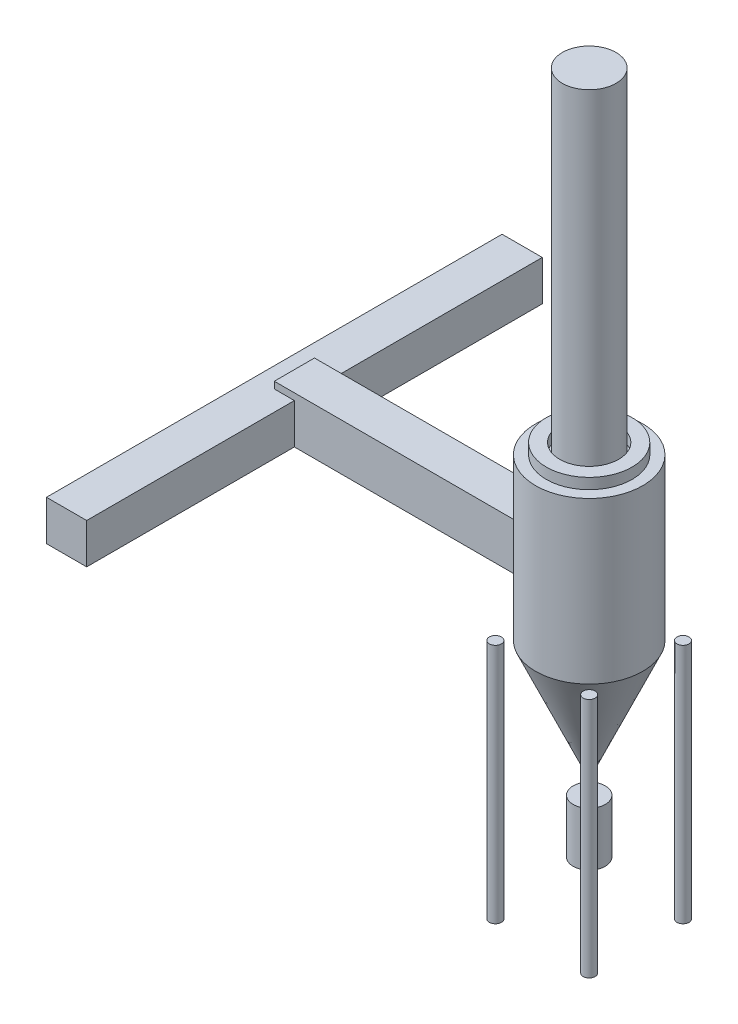
ISO-10303-21;
HEADER;
FILE_DESCRIPTION(('STEP AP214'),'2;1');
FILE_NAME('part.step','',(''),(''),'','','');
FILE_SCHEMA(('AUTOMOTIVE_DESIGN { 1 0 10303 214 1 1 1 1 }'));
ENDSEC;
DATA;
#1=APPLICATION_CONTEXT('core data for automotive mechanical design processes');
#2=APPLICATION_PROTOCOL_DEFINITION('international standard','automotive_design',2000,#1);
#3=PRODUCT_CONTEXT('',#1,'mechanical');
#4=PRODUCT('Part','Part','',(#3));
#5=PRODUCT_RELATED_PRODUCT_CATEGORY('part','',(#4));
#6=PRODUCT_DEFINITION_FORMATION('','',#4);
#7=PRODUCT_DEFINITION_CONTEXT('part definition',#1,'design');
#8=PRODUCT_DEFINITION('design','',#6,#7);
#9=PRODUCT_DEFINITION_SHAPE('','',#8);
#10=(LENGTH_UNIT() NAMED_UNIT(*) SI_UNIT(.MILLI.,.METRE.));
#11=(NAMED_UNIT(*) PLANE_ANGLE_UNIT() SI_UNIT($,.RADIAN.));
#12=(NAMED_UNIT(*) SI_UNIT($,.STERADIAN.) SOLID_ANGLE_UNIT());
#13=UNCERTAINTY_MEASURE_WITH_UNIT(LENGTH_MEASURE(1.E-05),#10,'distance_accuracy_value','');
#14=(GEOMETRIC_REPRESENTATION_CONTEXT(3) GLOBAL_UNCERTAINTY_ASSIGNED_CONTEXT((#13)) GLOBAL_UNIT_ASSIGNED_CONTEXT((#10,
#11,#12)) REPRESENTATION_CONTEXT('',''));
#15=CARTESIAN_POINT('',(0.,0.,0.));
#16=DIRECTION('',(0.,0.,1.));
#17=DIRECTION('',(1.,0.,0.));
#18=AXIS2_PLACEMENT_3D('',#15,#16,#17);
#19=CARTESIAN_POINT('',(150.,2400.,-3800.));
#20=DIRECTION('',(-1.,0.,0.));
#21=DIRECTION('',(0.,0.,1.));
#22=AXIS2_PLACEMENT_3D('',#19,#20,#21);
#23=PLANE('',#22);
#24=DIRECTION('',(0.,-1.,0.));
#25=VECTOR('',#24,1.);
#26=CARTESIAN_POINT('',(150.,2400.,-5350.));
#27=LINE('',#26,#25);
#28=CARTESIAN_POINT('',(150.,2400.,-5350.));
#29=VERTEX_POINT('',#28);
#30=CARTESIAN_POINT('',(150.,2100.,-5350.));
#31=VERTEX_POINT('',#30);
#32=EDGE_CURVE('E160',#29,#31,#27,.T.);
#33=ORIENTED_EDGE('',*,*,#32,.F.);
#34=DIRECTION('',(0.,0.,-1.));
#35=VECTOR('',#34,1.);
#36=CARTESIAN_POINT('',(150.,2400.,-3800.));
#37=LINE('',#36,#35);
#38=CARTESIAN_POINT('',(150.,2400.,-3800.));
#39=VERTEX_POINT('',#38);
#40=EDGE_CURVE('E172',#39,#29,#37,.T.);
#41=ORIENTED_EDGE('',*,*,#40,.F.);
#42=DIRECTION('',(0.,-1.,0.));
#43=VECTOR('',#42,1.);
#44=CARTESIAN_POINT('',(150.,2400.,-3800.));
#45=LINE('',#44,#43);
#46=CARTESIAN_POINT('',(150.,2100.,-3800.));
#47=VERTEX_POINT('',#46);
#48=EDGE_CURVE('E58',#39,#47,#45,.T.);
#49=ORIENTED_EDGE('',*,*,#48,.T.);
#50=DIRECTION('',(0.,0.,-1.));
#51=VECTOR('',#50,1.);
#52=CARTESIAN_POINT('',(150.,2100.,-3800.));
#53=LINE('',#52,#51);
#54=EDGE_CURVE('E182',#47,#31,#53,.T.);
#55=ORIENTED_EDGE('',*,*,#54,.T.);
#56=EDGE_LOOP('',(#33,#41,#49,#55));
#57=FACE_BOUND('',#56,.T.);
#58=ADVANCED_FACE('F50',(#57),#23,.F.);
#59=DIRECTION('',(0.,1.,0.));
#60=VECTOR('',#59,1.);
#61=CARTESIAN_POINT('',(150.,2400.,-5650.));
#62=LINE('',#61,#60);
#63=CARTESIAN_POINT('',(150.,2100.,-5650.));
#64=VERTEX_POINT('',#63);
#65=CARTESIAN_POINT('',(150.,2400.,-5650.));
#66=VERTEX_POINT('',#65);
#67=EDGE_CURVE('E151',#64,#66,#62,.T.);
#68=ORIENTED_EDGE('',*,*,#67,.F.);
#69=CARTESIAN_POINT('',(150.,2100.,-7200.));
#70=VERTEX_POINT('',#69);
#71=EDGE_CURVE('E181',#64,#70,#53,.T.);
#72=ORIENTED_EDGE('',*,*,#71,.T.);
#73=DIRECTION('',(0.,-1.,0.));
#74=VECTOR('',#73,1.);
#75=CARTESIAN_POINT('',(150.,2400.,-7200.));
#76=LINE('',#75,#74);
#77=CARTESIAN_POINT('',(150.,2400.,-7200.));
#78=VERTEX_POINT('',#77);
#79=EDGE_CURVE('E187',#78,#70,#76,.T.);
#80=ORIENTED_EDGE('',*,*,#79,.F.);
#81=EDGE_CURVE('E171',#66,#78,#37,.T.);
#82=ORIENTED_EDGE('',*,*,#81,.F.);
#83=EDGE_LOOP('',(#68,#72,#80,#82));
#84=FACE_BOUND('',#83,.T.);
#85=ADVANCED_FACE('F220',(#84),#23,.F.);
#86=CARTESIAN_POINT('',(0.,2400.,0.));
#87=DIRECTION('',(0.,-1.,0.));
#88=DIRECTION('',(0.,0.,-1.));
#89=AXIS2_PLACEMENT_3D('',#86,#87,#88);
#90=PLANE('',#89);
#91=DIRECTION('',(1.,0.,0.));
#92=VECTOR('',#91,1.);
#93=CARTESIAN_POINT('',(0.,2400.,-5350.));
#94=LINE('',#93,#92);
#95=CARTESIAN_POINT('',(0.,2400.,-5350.));
#96=VERTEX_POINT('',#95);
#97=EDGE_CURVE('E65',#96,#29,#94,.T.);
#98=ORIENTED_EDGE('',*,*,#97,.F.);
#99=DIRECTION('',(0.,0.,1.));
#100=VECTOR('',#99,1.);
#101=CARTESIAN_POINT('',(0.,2400.,0.));
#102=LINE('',#101,#100);
#103=CARTESIAN_POINT('',(0.,2400.,-5650.));
#104=VERTEX_POINT('',#103);
#105=EDGE_CURVE('E149',#104,#96,#102,.T.);
#106=ORIENTED_EDGE('',*,*,#105,.F.);
#107=DIRECTION('',(-1.,0.,0.));
#108=VECTOR('',#107,1.);
#109=CARTESIAN_POINT('',(0.,2400.,-5650.));
#110=LINE('',#109,#108);
#111=EDGE_CURVE('E71',#66,#104,#110,.T.);
#112=ORIENTED_EDGE('',*,*,#111,.F.);
#113=ORIENTED_EDGE('',*,*,#81,.T.);
#114=DIRECTION('',(-1.,0.,0.));
#115=VECTOR('',#114,1.);
#116=CARTESIAN_POINT('',(-150.,2400.,-7200.));
#117=LINE('',#116,#115);
#118=CARTESIAN_POINT('',(-150.,2400.,-7200.));
#119=VERTEX_POINT('',#118);
#120=EDGE_CURVE('E174',#78,#119,#117,.T.);
#121=ORIENTED_EDGE('',*,*,#120,.T.);
#122=DIRECTION('',(0.,0.,1.));
#123=VECTOR('',#122,1.);
#124=CARTESIAN_POINT('',(-150.,2400.,-3800.));
#125=LINE('',#124,#123);
#126=CARTESIAN_POINT('',(-150.,2400.,-3800.));
#127=VERTEX_POINT('',#126);
#128=EDGE_CURVE('E165',#119,#127,#125,.T.);
#129=ORIENTED_EDGE('',*,*,#128,.T.);
#130=DIRECTION('',(1.,0.,0.));
#131=VECTOR('',#130,1.);
#132=CARTESIAN_POINT('',(-150.,2400.,-3800.));
#133=LINE('',#132,#131);
#134=EDGE_CURVE('E168',#127,#39,#133,.T.);
#135=ORIENTED_EDGE('',*,*,#134,.T.);
#136=ORIENTED_EDGE('',*,*,#40,.T.);
#137=EDGE_LOOP('',(#98,#106,#112,#113,#121,#129,#135,#136));
#138=FACE_BOUND('',#137,.T.);
#139=ADVANCED_FACE('F226',(#138),#90,.F.);
#140=CARTESIAN_POINT('',(-150.,2400.,-3800.));
#141=DIRECTION('',(1.,0.,0.));
#142=DIRECTION('',(0.,0.,-1.));
#143=AXIS2_PLACEMENT_3D('',#140,#141,#142);
#144=PLANE('',#143);
#145=DIRECTION('',(0.,0.,1.));
#146=VECTOR('',#145,1.);
#147=CARTESIAN_POINT('',(-150.,2100.,-3800.));
#148=LINE('',#147,#146);
#149=CARTESIAN_POINT('',(-150.,2100.,-7200.));
#150=VERTEX_POINT('',#149);
#151=CARTESIAN_POINT('',(-150.,2100.,-3800.));
#152=VERTEX_POINT('',#151);
#153=EDGE_CURVE('E164',#150,#152,#148,.T.);
#154=ORIENTED_EDGE('',*,*,#153,.T.);
#155=DIRECTION('',(0.,-1.,0.));
#156=VECTOR('',#155,1.);
#157=CARTESIAN_POINT('',(-150.,2400.,-3800.));
#158=LINE('',#157,#156);
#159=EDGE_CURVE('E12',#127,#152,#158,.T.);
#160=ORIENTED_EDGE('',*,*,#159,.F.);
#161=ORIENTED_EDGE('',*,*,#128,.F.);
#162=DIRECTION('',(0.,-1.,0.));
#163=VECTOR('',#162,1.);
#164=CARTESIAN_POINT('',(-150.,2400.,-7200.));
#165=LINE('',#164,#163);
#166=EDGE_CURVE('E176',#119,#150,#165,.T.);
#167=ORIENTED_EDGE('',*,*,#166,.T.);
#168=EDGE_LOOP('',(#154,#160,#161,#167));
#169=FACE_BOUND('',#168,.T.);
#170=ADVANCED_FACE('F52',(#169),#144,.F.);
#171=CARTESIAN_POINT('',(-150.,2400.,-3800.));
#172=DIRECTION('',(0.,0.,-1.));
#173=DIRECTION('',(-1.,0.,0.));
#174=AXIS2_PLACEMENT_3D('',#171,#172,#173);
#175=PLANE('',#174);
#176=DIRECTION('',(1.,0.,0.));
#177=VECTOR('',#176,1.);
#178=CARTESIAN_POINT('',(-150.,2100.,-3800.));
#179=LINE('',#178,#177);
#180=EDGE_CURVE('E179',#152,#47,#179,.T.);
#181=ORIENTED_EDGE('',*,*,#180,.T.);
#182=ORIENTED_EDGE('',*,*,#48,.F.);
#183=ORIENTED_EDGE('',*,*,#134,.F.);
#184=ORIENTED_EDGE('',*,*,#159,.T.);
#185=EDGE_LOOP('',(#181,#182,#183,#184));
#186=FACE_BOUND('',#185,.T.);
#187=ADVANCED_FACE('F229',(#186),#175,.F.);
#188=CARTESIAN_POINT('',(-150.,2400.,-7200.));
#189=DIRECTION('',(0.,0.,1.));
#190=DIRECTION('',(1.,0.,0.));
#191=AXIS2_PLACEMENT_3D('',#188,#189,#190);
#192=PLANE('',#191);
#193=DIRECTION('',(-1.,0.,0.));
#194=VECTOR('',#193,1.);
#195=CARTESIAN_POINT('',(-150.,2100.,-7200.));
#196=LINE('',#195,#194);
#197=EDGE_CURVE('E169',#70,#150,#196,.T.);
#198=ORIENTED_EDGE('',*,*,#197,.T.);
#199=ORIENTED_EDGE('',*,*,#166,.F.);
#200=ORIENTED_EDGE('',*,*,#120,.F.);
#201=ORIENTED_EDGE('',*,*,#79,.T.);
#202=EDGE_LOOP('',(#198,#199,#200,#201));
#203=FACE_BOUND('',#202,.T.);
#204=ADVANCED_FACE('F223',(#203),#192,.F.);
#205=CARTESIAN_POINT('',(0.,2100.,0.));
#206=DIRECTION('',(0.,-1.,0.));
#207=DIRECTION('',(0.,0.,-1.));
#208=AXIS2_PLACEMENT_3D('',#205,#206,#207);
#209=PLANE('',#208);
#210=ORIENTED_EDGE('',*,*,#71,.F.);
#211=DIRECTION('',(-1.,0.,0.));
#212=VECTOR('',#211,1.);
#213=CARTESIAN_POINT('',(0.,2100.,-5650.));
#214=LINE('',#213,#212);
#215=CARTESIAN_POINT('',(1800.,2100.,-5650.));
#216=VERTEX_POINT('',#215);
#217=EDGE_CURVE('E146',#216,#64,#214,.T.);
#218=ORIENTED_EDGE('',*,*,#217,.F.);
#219=DIRECTION('',(0.,0.,-1.));
#220=VECTOR('',#219,1.);
#221=CARTESIAN_POINT('',(1800.,2100.,-5350.));
#222=LINE('',#221,#220);
#223=CARTESIAN_POINT('',(1800.,2100.,-5350.));
#224=VERTEX_POINT('',#223);
#225=EDGE_CURVE('E203',#224,#216,#222,.T.);
#226=ORIENTED_EDGE('',*,*,#225,.F.);
#227=DIRECTION('',(1.,0.,0.));
#228=VECTOR('',#227,1.);
#229=CARTESIAN_POINT('',(0.,2100.,-5350.));
#230=LINE('',#229,#228);
#231=EDGE_CURVE('E201',#31,#224,#230,.T.);
#232=ORIENTED_EDGE('',*,*,#231,.F.);
#233=ORIENTED_EDGE('',*,*,#54,.F.);
#234=ORIENTED_EDGE('',*,*,#180,.F.);
#235=ORIENTED_EDGE('',*,*,#153,.F.);
#236=ORIENTED_EDGE('',*,*,#197,.F.);
#237=EDGE_LOOP('',(#210,#218,#226,#232,#233,#234,#235,#236));
#238=FACE_BOUND('',#237,.T.);
#239=ADVANCED_FACE('F198',(#238),#209,.T.);
#240=CARTESIAN_POINT('',(0.,2450.,-5350.));
#241=DIRECTION('',(1.,0.,0.));
#242=DIRECTION('',(0.,0.,-1.));
#243=AXIS2_PLACEMENT_3D('',#240,#241,#242);
#244=PLANE('',#243);
#245=DIRECTION('',(0.,-1.,0.));
#246=VECTOR('',#245,1.);
#247=CARTESIAN_POINT('',(0.,2450.,-5650.));
#248=LINE('',#247,#246);
#249=CARTESIAN_POINT('',(0.,2450.,-5650.));
#250=VERTEX_POINT('',#249);
#251=EDGE_CURVE('E211',#250,#104,#248,.T.);
#252=ORIENTED_EDGE('',*,*,#251,.T.);
#253=ORIENTED_EDGE('',*,*,#105,.T.);
#254=DIRECTION('',(0.,-1.,0.));
#255=VECTOR('',#254,1.);
#256=CARTESIAN_POINT('',(0.,2450.,-5350.));
#257=LINE('',#256,#255);
#258=CARTESIAN_POINT('',(0.,2450.,-5350.));
#259=VERTEX_POINT('',#258);
#260=EDGE_CURVE('E131',#259,#96,#257,.T.);
#261=ORIENTED_EDGE('',*,*,#260,.F.);
#262=DIRECTION('',(0.,0.,1.));
#263=VECTOR('',#262,1.);
#264=CARTESIAN_POINT('',(0.,2450.,-5350.));
#265=LINE('',#264,#263);
#266=EDGE_CURVE('E137',#250,#259,#265,.T.);
#267=ORIENTED_EDGE('',*,*,#266,.F.);
#268=EDGE_LOOP('',(#252,#253,#261,#267));
#269=FACE_BOUND('',#268,.T.);
#270=ADVANCED_FACE('F148',(#269),#244,.F.);
#271=CARTESIAN_POINT('',(0.,2450.,-5350.));
#272=DIRECTION('',(0.,0.,-1.));
#273=DIRECTION('',(-1.,0.,0.));
#274=AXIS2_PLACEMENT_3D('',#271,#272,#273);
#275=PLANE('',#274);
#276=ORIENTED_EDGE('',*,*,#97,.T.);
#277=ORIENTED_EDGE('',*,*,#32,.T.);
#278=ORIENTED_EDGE('',*,*,#231,.T.);
#279=DIRECTION('',(0.,-1.,0.));
#280=VECTOR('',#279,1.);
#281=CARTESIAN_POINT('',(1800.,2450.,-5350.));
#282=LINE('',#281,#280);
#283=CARTESIAN_POINT('',(1800.,2450.,-5350.));
#284=VERTEX_POINT('',#283);
#285=EDGE_CURVE('E133',#284,#224,#282,.T.);
#286=ORIENTED_EDGE('',*,*,#285,.F.);
#287=DIRECTION('',(1.,0.,0.));
#288=VECTOR('',#287,1.);
#289=CARTESIAN_POINT('',(0.,2450.,-5350.));
#290=LINE('',#289,#288);
#291=EDGE_CURVE('E127',#259,#284,#290,.T.);
#292=ORIENTED_EDGE('',*,*,#291,.F.);
#293=ORIENTED_EDGE('',*,*,#260,.T.);
#294=EDGE_LOOP('',(#276,#277,#278,#286,#292,#293));
#295=FACE_BOUND('',#294,.T.);
#296=ADVANCED_FACE('F129',(#295),#275,.F.);
#297=CARTESIAN_POINT('',(0.,2450.,-5650.));
#298=DIRECTION('',(0.,0.,1.));
#299=DIRECTION('',(1.,0.,0.));
#300=AXIS2_PLACEMENT_3D('',#297,#298,#299);
#301=PLANE('',#300);
#302=ORIENTED_EDGE('',*,*,#217,.T.);
#303=ORIENTED_EDGE('',*,*,#67,.T.);
#304=ORIENTED_EDGE('',*,*,#111,.T.);
#305=ORIENTED_EDGE('',*,*,#251,.F.);
#306=DIRECTION('',(-1.,0.,0.));
#307=VECTOR('',#306,1.);
#308=CARTESIAN_POINT('',(0.,2450.,-5650.));
#309=LINE('',#308,#307);
#310=CARTESIAN_POINT('',(1800.,2450.,-5650.));
#311=VERTEX_POINT('',#310);
#312=EDGE_CURVE('E142',#311,#250,#309,.T.);
#313=ORIENTED_EDGE('',*,*,#312,.F.);
#314=DIRECTION('',(0.,-1.,0.));
#315=VECTOR('',#314,1.);
#316=CARTESIAN_POINT('',(1800.,2450.,-5650.));
#317=LINE('',#316,#315);
#318=EDGE_CURVE('E153',#311,#216,#317,.T.);
#319=ORIENTED_EDGE('',*,*,#318,.T.);
#320=EDGE_LOOP('',(#302,#303,#304,#305,#313,#319));
#321=FACE_BOUND('',#320,.T.);
#322=ADVANCED_FACE('F215',(#321),#301,.F.);
#323=CARTESIAN_POINT('',(1800.,2450.,-5350.));
#324=DIRECTION('',(-1.,0.,0.));
#325=DIRECTION('',(0.,0.,1.));
#326=AXIS2_PLACEMENT_3D('',#323,#324,#325);
#327=PLANE('',#326);
#328=ORIENTED_EDGE('',*,*,#225,.T.);
#329=ORIENTED_EDGE('',*,*,#318,.F.);
#330=DIRECTION('',(0.,0.,-1.));
#331=VECTOR('',#330,1.);
#332=CARTESIAN_POINT('',(1800.,2450.,-5350.));
#333=LINE('',#332,#331);
#334=EDGE_CURVE('E136',#284,#311,#333,.T.);
#335=ORIENTED_EDGE('',*,*,#334,.F.);
#336=ORIENTED_EDGE('',*,*,#285,.T.);
#337=EDGE_LOOP('',(#328,#329,#335,#336));
#338=FACE_BOUND('',#337,.T.);
#339=ADVANCED_FACE('F250',(#338),#327,.F.);
#340=CARTESIAN_POINT('',(0.,2450.,0.));
#341=DIRECTION('',(0.,-1.,0.));
#342=DIRECTION('',(0.,0.,-1.));
#343=AXIS2_PLACEMENT_3D('',#340,#341,#342);
#344=PLANE('',#343);
#345=ORIENTED_EDGE('',*,*,#266,.T.);
#346=ORIENTED_EDGE('',*,*,#291,.T.);
#347=ORIENTED_EDGE('',*,*,#334,.T.);
#348=ORIENTED_EDGE('',*,*,#312,.T.);
#349=EDGE_LOOP('',(#345,#346,#347,#348));
#350=FACE_BOUND('',#349,.T.);
#351=ADVANCED_FACE('F140',(#350),#344,.F.);
#352=CLOSED_SHELL('',(#58,#85,#139,#170,#187,#204,#239,#270,#296,#322,#339,#351));
#353=MANIFOLD_SOLID_BREP('B2',#352);
#354=CARTESIAN_POINT('',(2200.,1800.,-5500.));
#355=DIRECTION('',(0.,1.,0.));
#356=DIRECTION('',(0.,0.,1.));
#357=AXIS2_PLACEMENT_3D('',#354,#355,#356);
#358=CONICAL_SURFACE('',#357,400.,0.418879020478639);
#359=CARTESIAN_POINT('',(2200.,901.585290438313,-5500.));
#360=VERTEX_POINT('',#359);
#361=VERTEX_LOOP('',#360);
#362=FACE_BOUND('',#361,.T.);
#363=CARTESIAN_POINT('',(2200.,1800.,-5500.));
#364=DIRECTION('',(0.,1.,0.));
#365=DIRECTION('',(0.,0.,1.));
#366=AXIS2_PLACEMENT_3D('',#363,#364,#365);
#367=CIRCLE('',#366,400.);
#368=CARTESIAN_POINT('',(2200.,1800.,-5100.));
#369=VERTEX_POINT('',#368);
#370=EDGE_CURVE('E352',#369,#369,#367,.T.);
#371=ORIENTED_EDGE('',*,*,#370,.F.);
#372=EDGE_LOOP('',(#371));
#373=FACE_BOUND('',#372,.T.);
#374=ADVANCED_FACE('F338',(#362,#373),#358,.T.);
#375=CARTESIAN_POINT('',(2200.,3000.,-5500.));
#376=DIRECTION('',(0.,-1.,0.));
#377=DIRECTION('',(0.,0.,-1.));
#378=AXIS2_PLACEMENT_3D('',#375,#376,#377);
#379=CYLINDRICAL_SURFACE('',#378,400.);
#380=CARTESIAN_POINT('',(2200.,3000.,-5500.));
#381=DIRECTION('',(0.,1.,0.));
#382=DIRECTION('',(0.,0.,1.));
#383=AXIS2_PLACEMENT_3D('',#380,#381,#382);
#384=CIRCLE('',#383,400.);
#385=CARTESIAN_POINT('',(2200.,3000.,-5100.));
#386=VERTEX_POINT('',#385);
#387=EDGE_CURVE('E354',#386,#386,#384,.T.);
#388=ORIENTED_EDGE('',*,*,#387,.F.);
#389=EDGE_LOOP('',(#388));
#390=FACE_BOUND('',#389,.T.);
#391=ORIENTED_EDGE('',*,*,#370,.T.);
#392=EDGE_LOOP('',(#391));
#393=FACE_BOUND('',#392,.T.);
#394=ADVANCED_FACE('F349',(#390,#393),#379,.T.);
#395=CARTESIAN_POINT('',(2200.,3000.,-5500.));
#396=DIRECTION('',(0.,1.,0.));
#397=DIRECTION('',(0.,0.,1.));
#398=AXIS2_PLACEMENT_3D('',#395,#396,#397);
#399=PLANE('',#398);
#400=CARTESIAN_POINT('',(2200.,3000.,-5500.));
#401=DIRECTION('',(0.,1.,0.));
#402=DIRECTION('',(0.,0.,1.));
#403=AXIS2_PLACEMENT_3D('',#400,#401,#402);
#404=CIRCLE('',#403,320.);
#405=CARTESIAN_POINT('',(2200.,3000.,-5180.));
#406=VERTEX_POINT('',#405);
#407=EDGE_CURVE('E364',#406,#406,#404,.T.);
#408=ORIENTED_EDGE('',*,*,#407,.F.);
#409=EDGE_LOOP('',(#408));
#410=FACE_BOUND('',#409,.T.);
#411=ORIENTED_EDGE('',*,*,#387,.T.);
#412=EDGE_LOOP('',(#411));
#413=FACE_BOUND('',#412,.T.);
#414=ADVANCED_FACE('F379',(#410,#413),#399,.T.);
#415=CARTESIAN_POINT('',(2200.,3080.,-5500.));
#416=DIRECTION('',(0.,1.,0.));
#417=DIRECTION('',(0.,0.,1.));
#418=AXIS2_PLACEMENT_3D('',#415,#416,#417);
#419=PLANE('',#418);
#420=CARTESIAN_POINT('',(2200.,3080.,-5500.));
#421=DIRECTION('',(0.,1.,0.));
#422=DIRECTION('',(0.,0.,1.));
#423=AXIS2_PLACEMENT_3D('',#420,#421,#422);
#424=CIRCLE('',#423,320.);
#425=CARTESIAN_POINT('',(2200.,3080.,-5180.));
#426=VERTEX_POINT('',#425);
#427=EDGE_CURVE('E363',#426,#426,#424,.T.);
#428=ORIENTED_EDGE('',*,*,#427,.T.);
#429=EDGE_LOOP('',(#428));
#430=FACE_BOUND('',#429,.T.);
#431=CARTESIAN_POINT('',(2200.,3080.,-5500.));
#432=DIRECTION('',(0.,1.,0.));
#433=DIRECTION('',(0.,0.,1.));
#434=AXIS2_PLACEMENT_3D('',#431,#432,#433);
#435=CIRCLE('',#434,220.);
#436=CARTESIAN_POINT('',(2200.,3080.,-5280.));
#437=VERTEX_POINT('',#436);
#438=EDGE_CURVE('E367',#437,#437,#435,.T.);
#439=ORIENTED_EDGE('',*,*,#438,.F.);
#440=EDGE_LOOP('',(#439));
#441=FACE_BOUND('',#440,.T.);
#442=ADVANCED_FACE('F376',(#430,#441),#419,.T.);
#443=CARTESIAN_POINT('',(2200.,3080.,-5500.));
#444=DIRECTION('',(0.,-1.,0.));
#445=DIRECTION('',(0.,0.,-1.));
#446=AXIS2_PLACEMENT_3D('',#443,#444,#445);
#447=CYLINDRICAL_SURFACE('',#446,320.);
#448=ORIENTED_EDGE('',*,*,#427,.F.);
#449=EDGE_LOOP('',(#448));
#450=FACE_BOUND('',#449,.T.);
#451=ORIENTED_EDGE('',*,*,#407,.T.);
#452=EDGE_LOOP('',(#451));
#453=FACE_BOUND('',#452,.T.);
#454=ADVANCED_FACE('F378',(#450,#453),#447,.T.);
#455=CARTESIAN_POINT('',(2200.,3080.,-5500.));
#456=DIRECTION('',(0.,-1.,0.));
#457=DIRECTION('',(0.,0.,-1.));
#458=AXIS2_PLACEMENT_3D('',#455,#456,#457);
#459=CYLINDRICAL_SURFACE('',#458,220.);
#460=ORIENTED_EDGE('',*,*,#438,.T.);
#461=EDGE_LOOP('',(#460));
#462=FACE_BOUND('',#461,.T.);
#463=CARTESIAN_POINT('',(2200.,3000.,-5500.));
#464=DIRECTION('',(0.,1.,0.));
#465=DIRECTION('',(0.,0.,1.));
#466=AXIS2_PLACEMENT_3D('',#463,#464,#465);
#467=CIRCLE('',#466,220.);
#468=CARTESIAN_POINT('',(2200.,3000.,-5280.));
#469=VERTEX_POINT('',#468);
#470=EDGE_CURVE('E48',#469,#469,#467,.F.);
#471=ORIENTED_EDGE('',*,*,#470,.T.);
#472=EDGE_LOOP('',(#471));
#473=FACE_BOUND('',#472,.T.);
#474=ADVANCED_FACE('F373',(#462,#473),#459,.F.);
#475=CARTESIAN_POINT('',(2200.,5500.,-5500.));
#476=DIRECTION('',(0.,1.,0.));
#477=DIRECTION('',(0.,0.,1.));
#478=AXIS2_PLACEMENT_3D('',#475,#476,#477);
#479=PLANE('',#478);
#480=CARTESIAN_POINT('',(2200.,5500.,-5500.));
#481=DIRECTION('',(0.,1.,0.));
#482=DIRECTION('',(0.,0.,1.));
#483=AXIS2_PLACEMENT_3D('',#480,#481,#482);
#484=CIRCLE('',#483,200.);
#485=CARTESIAN_POINT('',(2200.,5500.,-5300.));
#486=VERTEX_POINT('',#485);
#487=EDGE_CURVE('E358',#486,#486,#484,.T.);
#488=ORIENTED_EDGE('',*,*,#487,.T.);
#489=EDGE_LOOP('',(#488));
#490=FACE_BOUND('',#489,.T.);
#491=ADVANCED_FACE('F393',(#490),#479,.T.);
#492=CARTESIAN_POINT('',(2200.,5500.,-5500.));
#493=DIRECTION('',(0.,-1.,0.));
#494=DIRECTION('',(0.,0.,-1.));
#495=AXIS2_PLACEMENT_3D('',#492,#493,#494);
#496=CYLINDRICAL_SURFACE('',#495,200.);
#497=ORIENTED_EDGE('',*,*,#487,.F.);
#498=EDGE_LOOP('',(#497));
#499=FACE_BOUND('',#498,.T.);
#500=CARTESIAN_POINT('',(2200.,3000.,-5500.));
#501=DIRECTION('',(0.,1.,0.));
#502=DIRECTION('',(0.,0.,1.));
#503=AXIS2_PLACEMENT_3D('',#500,#501,#502);
#504=CIRCLE('',#503,200.);
#505=CARTESIAN_POINT('',(2200.,3000.,-5300.));
#506=VERTEX_POINT('',#505);
#507=EDGE_CURVE('E344',#506,#506,#504,.T.);
#508=ORIENTED_EDGE('',*,*,#507,.T.);
#509=EDGE_LOOP('',(#508));
#510=FACE_BOUND('',#509,.T.);
#511=ADVANCED_FACE('F396',(#499,#510),#496,.T.);
#512=ORIENTED_EDGE('',*,*,#507,.F.);
#513=EDGE_LOOP('',(#512));
#514=FACE_BOUND('',#513,.T.);
#515=ORIENTED_EDGE('',*,*,#470,.F.);
#516=EDGE_LOOP('',(#515));
#517=FACE_BOUND('',#516,.T.);
#518=ADVANCED_FACE('F390',(#514,#517),#399,.T.);
#519=CLOSED_SHELL('',(#374,#394,#414,#442,#454,#474,#491,#511,#518));
#520=MANIFOLD_SOLID_BREP('B6',#519);
#521=CARTESIAN_POINT('',(2200.,800.,-5500.));
#522=DIRECTION('',(0.,-1.,0.));
#523=DIRECTION('',(0.,0.,-1.));
#524=AXIS2_PLACEMENT_3D('',#521,#522,#523);
#525=CYLINDRICAL_SURFACE('',#524,120.);
#526=CARTESIAN_POINT('',(2200.,800.,-5500.));
#527=DIRECTION('',(0.,1.,0.));
#528=DIRECTION('',(0.,0.,1.));
#529=AXIS2_PLACEMENT_3D('',#526,#527,#528);
#530=CIRCLE('',#529,120.);
#531=CARTESIAN_POINT('',(2200.,800.,-5380.));
#532=VERTEX_POINT('',#531);
#533=EDGE_CURVE('E337',#532,#532,#530,.T.);
#534=ORIENTED_EDGE('',*,*,#533,.F.);
#535=EDGE_LOOP('',(#534));
#536=FACE_BOUND('',#535,.T.);
#537=CARTESIAN_POINT('',(2200.,400.,-5500.));
#538=DIRECTION('',(0.,1.,0.));
#539=DIRECTION('',(0.,0.,1.));
#540=AXIS2_PLACEMENT_3D('',#537,#538,#539);
#541=CIRCLE('',#540,120.);
#542=CARTESIAN_POINT('',(2200.,400.,-5380.));
#543=VERTEX_POINT('',#542);
#544=EDGE_CURVE('E481',#543,#543,#541,.T.);
#545=ORIENTED_EDGE('',*,*,#544,.T.);
#546=EDGE_LOOP('',(#545));
#547=FACE_BOUND('',#546,.T.);
#548=ADVANCED_FACE('F478',(#536,#547),#525,.T.);
#549=CARTESIAN_POINT('',(2200.,800.,-5500.));
#550=DIRECTION('',(0.,1.,0.));
#551=DIRECTION('',(0.,0.,1.));
#552=AXIS2_PLACEMENT_3D('',#549,#550,#551);
#553=PLANE('',#552);
#554=ORIENTED_EDGE('',*,*,#533,.T.);
#555=EDGE_LOOP('',(#554));
#556=FACE_BOUND('',#555,.T.);
#557=ADVANCED_FACE('F493',(#556),#553,.T.);
#558=CARTESIAN_POINT('',(2200.,400.,-5500.));
#559=DIRECTION('',(0.,1.,0.));
#560=DIRECTION('',(0.,0.,1.));
#561=AXIS2_PLACEMENT_3D('',#558,#559,#560);
#562=PLANE('',#561);
#563=ORIENTED_EDGE('',*,*,#544,.F.);
#564=EDGE_LOOP('',(#563));
#565=FACE_BOUND('',#564,.T.);
#566=ADVANCED_FACE('F491',(#565),#562,.F.);
#567=CLOSED_SHELL('',(#548,#557,#566));
#568=MANIFOLD_SOLID_BREP('B42',#567);
#569=CARTESIAN_POINT('',(2550.,1800.,-5850.));
#570=DIRECTION('',(0.,-1.,0.));
#571=DIRECTION('',(0.,0.,-1.));
#572=AXIS2_PLACEMENT_3D('',#569,#570,#571);
#573=CYLINDRICAL_SURFACE('',#572,44.9999999999998);
#574=CARTESIAN_POINT('',(2550.,1800.,-5850.));
#575=DIRECTION('',(0.,1.,0.));
#576=DIRECTION('',(0.,0.,1.));
#577=AXIS2_PLACEMENT_3D('',#574,#575,#576);
#578=CIRCLE('',#577,44.9999999999998);
#579=CARTESIAN_POINT('',(2550.,1800.,-5805.));
#580=VERTEX_POINT('',#579);
#581=EDGE_CURVE('E477',#580,#580,#578,.T.);
#582=ORIENTED_EDGE('',*,*,#581,.F.);
#583=EDGE_LOOP('',(#582));
#584=FACE_BOUND('',#583,.T.);
#585=CARTESIAN_POINT('',(2550.,0.,-5850.));
#586=DIRECTION('',(0.,1.,0.));
#587=DIRECTION('',(0.,0.,1.));
#588=AXIS2_PLACEMENT_3D('',#585,#586,#587);
#589=CIRCLE('',#588,44.9999999999998);
#590=CARTESIAN_POINT('',(2550.,0.,-5805.));
#591=VERTEX_POINT('',#590);
#592=EDGE_CURVE('E530',#591,#591,#589,.T.);
#593=ORIENTED_EDGE('',*,*,#592,.T.);
#594=EDGE_LOOP('',(#593));
#595=FACE_BOUND('',#594,.T.);
#596=ADVANCED_FACE('F527',(#584,#595),#573,.T.);
#597=CARTESIAN_POINT('',(2550.,1800.,-5850.));
#598=DIRECTION('',(0.,1.,0.));
#599=DIRECTION('',(0.,0.,1.));
#600=AXIS2_PLACEMENT_3D('',#597,#598,#599);
#601=PLANE('',#600);
#602=ORIENTED_EDGE('',*,*,#581,.T.);
#603=EDGE_LOOP('',(#602));
#604=FACE_BOUND('',#603,.T.);
#605=ADVANCED_FACE('F542',(#604),#601,.T.);
#606=CARTESIAN_POINT('',(2550.,0.,-5850.));
#607=DIRECTION('',(0.,1.,0.));
#608=DIRECTION('',(0.,0.,1.));
#609=AXIS2_PLACEMENT_3D('',#606,#607,#608);
#610=PLANE('',#609);
#611=ORIENTED_EDGE('',*,*,#592,.F.);
#612=EDGE_LOOP('',(#611));
#613=FACE_BOUND('',#612,.T.);
#614=ADVANCED_FACE('F540',(#613),#610,.F.);
#615=CLOSED_SHELL('',(#596,#605,#614));
#616=MANIFOLD_SOLID_BREP('B332',#615);
#617=CARTESIAN_POINT('',(1850.,1800.,-5850.));
#618=DIRECTION('',(0.,-1.,0.));
#619=DIRECTION('',(0.,0.,-1.));
#620=AXIS2_PLACEMENT_3D('',#617,#618,#619);
#621=CYLINDRICAL_SURFACE('',#620,45.);
#622=CARTESIAN_POINT('',(1850.,1800.,-5850.));
#623=DIRECTION('',(0.,1.,0.));
#624=DIRECTION('',(0.,0.,1.));
#625=AXIS2_PLACEMENT_3D('',#622,#623,#624);
#626=CIRCLE('',#625,45.);
#627=CARTESIAN_POINT('',(1850.,1800.,-5805.));
#628=VERTEX_POINT('',#627);
#629=EDGE_CURVE('E526',#628,#628,#626,.T.);
#630=ORIENTED_EDGE('',*,*,#629,.F.);
#631=EDGE_LOOP('',(#630));
#632=FACE_BOUND('',#631,.T.);
#633=CARTESIAN_POINT('',(1850.,0.,-5850.));
#634=DIRECTION('',(0.,1.,0.));
#635=DIRECTION('',(0.,0.,1.));
#636=AXIS2_PLACEMENT_3D('',#633,#634,#635);
#637=CIRCLE('',#636,45.);
#638=CARTESIAN_POINT('',(1850.,0.,-5805.));
#639=VERTEX_POINT('',#638);
#640=EDGE_CURVE('E579',#639,#639,#637,.T.);
#641=ORIENTED_EDGE('',*,*,#640,.T.);
#642=EDGE_LOOP('',(#641));
#643=FACE_BOUND('',#642,.T.);
#644=ADVANCED_FACE('F576',(#632,#643),#621,.T.);
#645=CARTESIAN_POINT('',(1850.,1800.,-5850.));
#646=DIRECTION('',(0.,1.,0.));
#647=DIRECTION('',(0.,0.,1.));
#648=AXIS2_PLACEMENT_3D('',#645,#646,#647);
#649=PLANE('',#648);
#650=ORIENTED_EDGE('',*,*,#629,.T.);
#651=EDGE_LOOP('',(#650));
#652=FACE_BOUND('',#651,.T.);
#653=ADVANCED_FACE('F591',(#652),#649,.T.);
#654=CARTESIAN_POINT('',(1850.,0.,-5850.));
#655=DIRECTION('',(0.,1.,0.));
#656=DIRECTION('',(0.,0.,1.));
#657=AXIS2_PLACEMENT_3D('',#654,#655,#656);
#658=PLANE('',#657);
#659=ORIENTED_EDGE('',*,*,#640,.F.);
#660=EDGE_LOOP('',(#659));
#661=FACE_BOUND('',#660,.T.);
#662=ADVANCED_FACE('F589',(#661),#658,.F.);
#663=CLOSED_SHELL('',(#644,#653,#662));
#664=MANIFOLD_SOLID_BREP('B472',#663);
#665=CARTESIAN_POINT('',(2550.,1800.,-5150.));
#666=DIRECTION('',(0.,-1.,0.));
#667=DIRECTION('',(0.,0.,-1.));
#668=AXIS2_PLACEMENT_3D('',#665,#666,#667);
#669=CYLINDRICAL_SURFACE('',#668,44.9999999999998);
#670=CARTESIAN_POINT('',(2550.,1800.,-5150.));
#671=DIRECTION('',(0.,1.,0.));
#672=DIRECTION('',(0.,0.,1.));
#673=AXIS2_PLACEMENT_3D('',#670,#671,#672);
#674=CIRCLE('',#673,44.9999999999998);
#675=CARTESIAN_POINT('',(2550.,1800.,-5105.));
#676=VERTEX_POINT('',#675);
#677=EDGE_CURVE('E575',#676,#676,#674,.T.);
#678=ORIENTED_EDGE('',*,*,#677,.F.);
#679=EDGE_LOOP('',(#678));
#680=FACE_BOUND('',#679,.T.);
#681=CARTESIAN_POINT('',(2550.,0.,-5150.));
#682=DIRECTION('',(0.,1.,0.));
#683=DIRECTION('',(0.,0.,1.));
#684=AXIS2_PLACEMENT_3D('',#681,#682,#683);
#685=CIRCLE('',#684,44.9999999999998);
#686=CARTESIAN_POINT('',(2550.,0.,-5105.));
#687=VERTEX_POINT('',#686);
#688=EDGE_CURVE('E627',#687,#687,#685,.T.);
#689=ORIENTED_EDGE('',*,*,#688,.T.);
#690=EDGE_LOOP('',(#689));
#691=FACE_BOUND('',#690,.T.);
#692=ADVANCED_FACE('F624',(#680,#691),#669,.T.);
#693=CARTESIAN_POINT('',(2550.,1800.,-5150.));
#694=DIRECTION('',(0.,1.,0.));
#695=DIRECTION('',(0.,0.,1.));
#696=AXIS2_PLACEMENT_3D('',#693,#694,#695);
#697=PLANE('',#696);
#698=ORIENTED_EDGE('',*,*,#677,.T.);
#699=EDGE_LOOP('',(#698));
#700=FACE_BOUND('',#699,.T.);
#701=ADVANCED_FACE('F639',(#700),#697,.T.);
#702=CARTESIAN_POINT('',(2550.,0.,-5150.));
#703=DIRECTION('',(0.,1.,0.));
#704=DIRECTION('',(0.,0.,1.));
#705=AXIS2_PLACEMENT_3D('',#702,#703,#704);
#706=PLANE('',#705);
#707=ORIENTED_EDGE('',*,*,#688,.F.);
#708=EDGE_LOOP('',(#707));
#709=FACE_BOUND('',#708,.T.);
#710=ADVANCED_FACE('F637',(#709),#706,.F.);
#711=CLOSED_SHELL('',(#692,#701,#710));
#712=MANIFOLD_SOLID_BREP('B521',#711);
#713=CARTESIAN_POINT('',(1850.,1800.,-5150.));
#714=DIRECTION('',(0.,-1.,0.));
#715=DIRECTION('',(0.,0.,-1.));
#716=AXIS2_PLACEMENT_3D('',#713,#714,#715);
#717=CYLINDRICAL_SURFACE('',#716,45.);
#718=CARTESIAN_POINT('',(1850.,1800.,-5150.));
#719=DIRECTION('',(0.,1.,0.));
#720=DIRECTION('',(0.,0.,1.));
#721=AXIS2_PLACEMENT_3D('',#718,#719,#720);
#722=CIRCLE('',#721,45.);
#723=CARTESIAN_POINT('',(1850.,1800.,-5105.));
#724=VERTEX_POINT('',#723);
#725=EDGE_CURVE('E623',#724,#724,#722,.T.);
#726=ORIENTED_EDGE('',*,*,#725,.F.);
#727=EDGE_LOOP('',(#726));
#728=FACE_BOUND('',#727,.T.);
#729=CARTESIAN_POINT('',(1850.,0.,-5150.));
#730=DIRECTION('',(0.,1.,0.));
#731=DIRECTION('',(0.,0.,1.));
#732=AXIS2_PLACEMENT_3D('',#729,#730,#731);
#733=CIRCLE('',#732,45.);
#734=CARTESIAN_POINT('',(1850.,0.,-5105.));
#735=VERTEX_POINT('',#734);
#736=EDGE_CURVE('E668',#735,#735,#733,.T.);
#737=ORIENTED_EDGE('',*,*,#736,.T.);
#738=EDGE_LOOP('',(#737));
#739=FACE_BOUND('',#738,.T.);
#740=ADVANCED_FACE('F665',(#728,#739),#717,.T.);
#741=CARTESIAN_POINT('',(1850.,1800.,-5150.));
#742=DIRECTION('',(0.,1.,0.));
#743=DIRECTION('',(0.,0.,1.));
#744=AXIS2_PLACEMENT_3D('',#741,#742,#743);
#745=PLANE('',#744);
#746=ORIENTED_EDGE('',*,*,#725,.T.);
#747=EDGE_LOOP('',(#746));
#748=FACE_BOUND('',#747,.T.);
#749=ADVANCED_FACE('F680',(#748),#745,.T.);
#750=CARTESIAN_POINT('',(1850.,0.,-5150.));
#751=DIRECTION('',(0.,1.,0.));
#752=DIRECTION('',(0.,0.,1.));
#753=AXIS2_PLACEMENT_3D('',#750,#751,#752);
#754=PLANE('',#753);
#755=ORIENTED_EDGE('',*,*,#736,.F.);
#756=EDGE_LOOP('',(#755));
#757=FACE_BOUND('',#756,.T.);
#758=ADVANCED_FACE('F678',(#757),#754,.F.);
#759=CLOSED_SHELL('',(#740,#749,#758));
#760=MANIFOLD_SOLID_BREP('B570',#759);
#761=ADVANCED_BREP_SHAPE_REPRESENTATION('',(#18,#353,#520,#568,#616,#664,#712,#760),#14);
#762=SHAPE_DEFINITION_REPRESENTATION(#9,#761);
ENDSEC;
END-ISO-10303-21;
